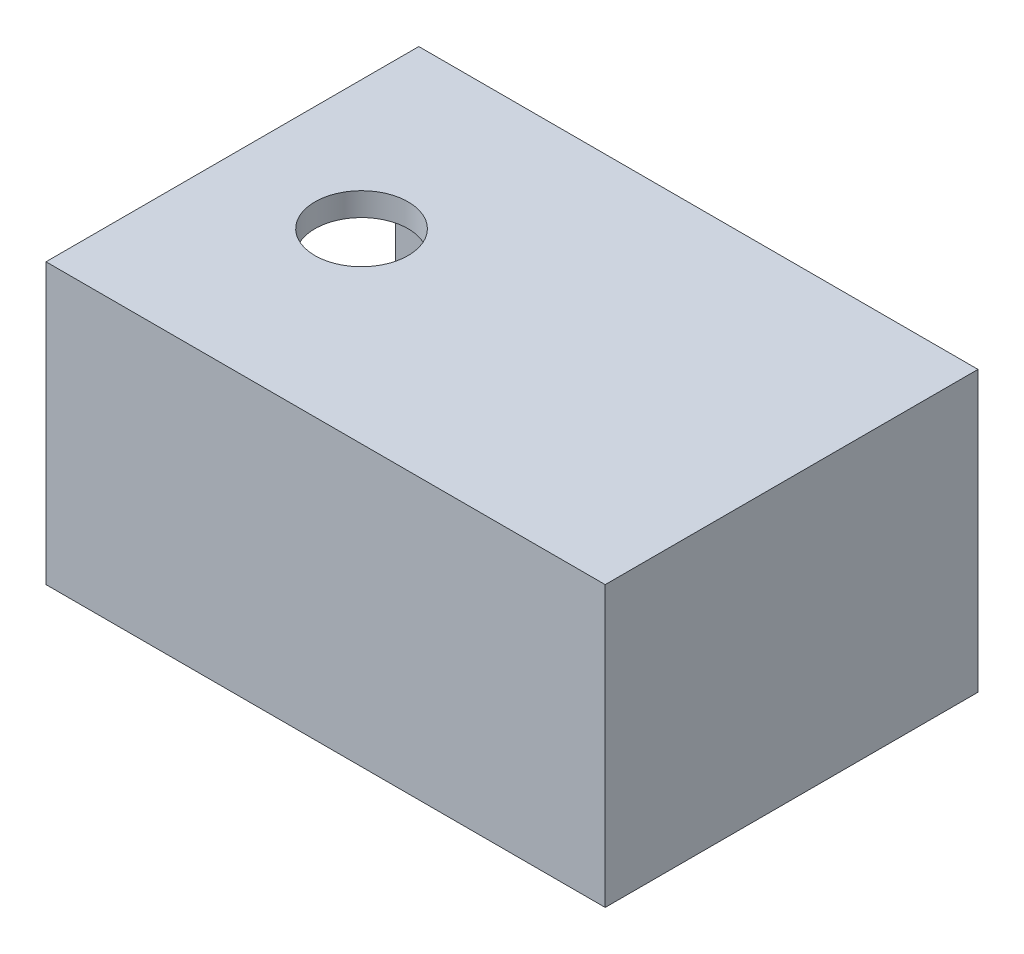
ISO-10303-21;
HEADER;
FILE_DESCRIPTION(('STEP AP214'),'2;1');
FILE_NAME('part.step','',(''),(''),'','','');
FILE_SCHEMA(('AUTOMOTIVE_DESIGN { 1 0 10303 214 1 1 1 1 }'));
ENDSEC;
DATA;
#1=APPLICATION_CONTEXT('core data for automotive mechanical design processes');
#2=APPLICATION_PROTOCOL_DEFINITION('international standard','automotive_design',2000,#1);
#3=PRODUCT_CONTEXT('',#1,'mechanical');
#4=PRODUCT('Part','Part','',(#3));
#5=PRODUCT_RELATED_PRODUCT_CATEGORY('part','',(#4));
#6=PRODUCT_DEFINITION_FORMATION('','',#4);
#7=PRODUCT_DEFINITION_CONTEXT('part definition',#1,'design');
#8=PRODUCT_DEFINITION('design','',#6,#7);
#9=PRODUCT_DEFINITION_SHAPE('','',#8);
#10=(LENGTH_UNIT() NAMED_UNIT(*) SI_UNIT(.MILLI.,.METRE.));
#11=(NAMED_UNIT(*) PLANE_ANGLE_UNIT() SI_UNIT($,.RADIAN.));
#12=(NAMED_UNIT(*) SI_UNIT($,.STERADIAN.) SOLID_ANGLE_UNIT());
#13=UNCERTAINTY_MEASURE_WITH_UNIT(LENGTH_MEASURE(1.E-05),#10,'distance_accuracy_value','');
#14=(GEOMETRIC_REPRESENTATION_CONTEXT(3) GLOBAL_UNCERTAINTY_ASSIGNED_CONTEXT((#13)) GLOBAL_UNIT_ASSIGNED_CONTEXT((#10,
#11,#12)) REPRESENTATION_CONTEXT('',''));
#15=CARTESIAN_POINT('',(0.,0.,0.));
#16=DIRECTION('',(0.,0.,1.));
#17=DIRECTION('',(1.,0.,0.));
#18=AXIS2_PLACEMENT_3D('',#15,#16,#17);
#19=CARTESIAN_POINT('',(-40.6105391688684,30.,17.562891057013));
#20=DIRECTION('',(1.,0.,0.));
#21=DIRECTION('',(0.,0.,-1.));
#22=AXIS2_PLACEMENT_3D('',#19,#20,#21);
#23=PLANE('',#22);
#24=DIRECTION('',(0.,1.,0.));
#25=VECTOR('',#24,1.);
#26=CARTESIAN_POINT('',(-40.6105391688684,2.5,15.062891057013));
#27=LINE('',#26,#25);
#28=CARTESIAN_POINT('',(-40.6105391688684,2.5,15.062891057013));
#29=VERTEX_POINT('',#28);
#30=CARTESIAN_POINT('',(-40.6105391688684,27.5,15.062891057013));
#31=VERTEX_POINT('',#30);
#32=EDGE_CURVE('E142',#29,#31,#27,.T.);
#33=ORIENTED_EDGE('',*,*,#32,.F.);
#34=DIRECTION('',(0.,0.,1.));
#35=VECTOR('',#34,1.);
#36=CARTESIAN_POINT('',(-40.6105391688684,2.5,-19.937108942987));
#37=LINE('',#36,#35);
#38=CARTESIAN_POINT('',(-40.6105391688684,2.5,-19.937108942987));
#39=VERTEX_POINT('',#38);
#40=EDGE_CURVE('E50',#39,#29,#37,.T.);
#41=ORIENTED_EDGE('',*,*,#40,.F.);
#42=DIRECTION('',(0.,-1.,0.));
#43=VECTOR('',#42,1.);
#44=CARTESIAN_POINT('',(-40.6105391688684,2.5,-19.937108942987));
#45=LINE('',#44,#43);
#46=CARTESIAN_POINT('',(-40.6105391688684,27.5,-19.937108942987));
#47=VERTEX_POINT('',#46);
#48=EDGE_CURVE('E130',#47,#39,#45,.T.);
#49=ORIENTED_EDGE('',*,*,#48,.F.);
#50=DIRECTION('',(0.,0.,-1.));
#51=VECTOR('',#50,1.);
#52=CARTESIAN_POINT('',(-40.6105391688684,27.5,-19.937108942987));
#53=LINE('',#52,#51);
#54=EDGE_CURVE('E133',#31,#47,#53,.T.);
#55=ORIENTED_EDGE('',*,*,#54,.F.);
#56=EDGE_LOOP('',(#33,#41,#49,#55));
#57=FACE_BOUND('',#56,.T.);
#58=DIRECTION('',(0.,0.,1.));
#59=VECTOR('',#58,1.);
#60=CARTESIAN_POINT('',(-40.6105391688684,0.,17.562891057013));
#61=LINE('',#60,#59);
#62=CARTESIAN_POINT('',(-40.6105391688684,0.,-22.437108942987));
#63=VERTEX_POINT('',#62);
#64=CARTESIAN_POINT('',(-40.6105391688684,0.,17.562891057013));
#65=VERTEX_POINT('',#64);
#66=EDGE_CURVE('E148',#63,#65,#61,.T.);
#67=ORIENTED_EDGE('',*,*,#66,.T.);
#68=DIRECTION('',(0.,-1.,0.));
#69=VECTOR('',#68,1.);
#70=CARTESIAN_POINT('',(-40.6105391688684,30.,17.562891057013));
#71=LINE('',#70,#69);
#72=CARTESIAN_POINT('',(-40.6105391688684,30.,17.562891057013));
#73=VERTEX_POINT('',#72);
#74=EDGE_CURVE('E172',#73,#65,#71,.T.);
#75=ORIENTED_EDGE('',*,*,#74,.F.);
#76=DIRECTION('',(0.,0.,1.));
#77=VECTOR('',#76,1.);
#78=CARTESIAN_POINT('',(-40.6105391688684,30.,17.562891057013));
#79=LINE('',#78,#77);
#80=CARTESIAN_POINT('',(-40.6105391688684,30.,-22.437108942987));
#81=VERTEX_POINT('',#80);
#82=EDGE_CURVE('E152',#81,#73,#79,.T.);
#83=ORIENTED_EDGE('',*,*,#82,.F.);
#84=DIRECTION('',(0.,-1.,0.));
#85=VECTOR('',#84,1.);
#86=CARTESIAN_POINT('',(-40.6105391688684,30.,-22.437108942987));
#87=LINE('',#86,#85);
#88=EDGE_CURVE('E158',#81,#63,#87,.T.);
#89=ORIENTED_EDGE('',*,*,#88,.T.);
#90=EDGE_LOOP('',(#67,#75,#83,#89));
#91=FACE_BOUND('',#90,.T.);
#92=ADVANCED_FACE('F34',(#57,#91),#23,.F.);
#93=CARTESIAN_POINT('',(-40.6105391688684,30.,17.562891057013));
#94=DIRECTION('',(0.,0.,-1.));
#95=DIRECTION('',(-1.,0.,0.));
#96=AXIS2_PLACEMENT_3D('',#93,#94,#95);
#97=PLANE('',#96);
#98=DIRECTION('',(1.,0.,0.));
#99=VECTOR('',#98,1.);
#100=CARTESIAN_POINT('',(-40.6105391688684,0.,17.562891057013));
#101=LINE('',#100,#99);
#102=CARTESIAN_POINT('',(19.3894608311315,0.,17.562891057013));
#103=VERTEX_POINT('',#102);
#104=EDGE_CURVE('E161',#65,#103,#101,.T.);
#105=ORIENTED_EDGE('',*,*,#104,.T.);
#106=DIRECTION('',(0.,-1.,0.));
#107=VECTOR('',#106,1.);
#108=CARTESIAN_POINT('',(19.3894608311315,30.,17.562891057013));
#109=LINE('',#108,#107);
#110=CARTESIAN_POINT('',(19.3894608311315,30.,17.562891057013));
#111=VERTEX_POINT('',#110);
#112=EDGE_CURVE('E169',#111,#103,#109,.T.);
#113=ORIENTED_EDGE('',*,*,#112,.F.);
#114=DIRECTION('',(1.,0.,0.));
#115=VECTOR('',#114,1.);
#116=CARTESIAN_POINT('',(-40.6105391688684,30.,17.562891057013));
#117=LINE('',#116,#115);
#118=EDGE_CURVE('E88',#73,#111,#117,.T.);
#119=ORIENTED_EDGE('',*,*,#118,.F.);
#120=ORIENTED_EDGE('',*,*,#74,.T.);
#121=EDGE_LOOP('',(#105,#113,#119,#120));
#122=FACE_BOUND('',#121,.T.);
#123=ADVANCED_FACE('F192',(#122),#97,.F.);
#124=CARTESIAN_POINT('',(19.3894608311315,30.,17.562891057013));
#125=DIRECTION('',(-1.,0.,0.));
#126=DIRECTION('',(0.,0.,1.));
#127=AXIS2_PLACEMENT_3D('',#124,#125,#126);
#128=PLANE('',#127);
#129=DIRECTION('',(0.,0.,-1.));
#130=VECTOR('',#129,1.);
#131=CARTESIAN_POINT('',(19.3894608311315,0.,17.562891057013));
#132=LINE('',#131,#130);
#133=CARTESIAN_POINT('',(19.3894608311316,0.,-22.437108942987));
#134=VERTEX_POINT('',#133);
#135=EDGE_CURVE('E163',#103,#134,#132,.T.);
#136=ORIENTED_EDGE('',*,*,#135,.T.);
#137=DIRECTION('',(0.,-1.,0.));
#138=VECTOR('',#137,1.);
#139=CARTESIAN_POINT('',(19.3894608311316,30.,-22.437108942987));
#140=LINE('',#139,#138);
#141=CARTESIAN_POINT('',(19.3894608311316,30.,-22.437108942987));
#142=VERTEX_POINT('',#141);
#143=EDGE_CURVE('E167',#142,#134,#140,.T.);
#144=ORIENTED_EDGE('',*,*,#143,.F.);
#145=DIRECTION('',(0.,0.,-1.));
#146=VECTOR('',#145,1.);
#147=CARTESIAN_POINT('',(19.3894608311315,30.,17.562891057013));
#148=LINE('',#147,#146);
#149=EDGE_CURVE('E155',#111,#142,#148,.T.);
#150=ORIENTED_EDGE('',*,*,#149,.F.);
#151=ORIENTED_EDGE('',*,*,#112,.T.);
#152=EDGE_LOOP('',(#136,#144,#150,#151));
#153=FACE_BOUND('',#152,.T.);
#154=ADVANCED_FACE('F197',(#153),#128,.F.);
#155=CARTESIAN_POINT('',(-40.6105391688684,30.,-22.437108942987));
#156=DIRECTION('',(0.,0.,1.));
#157=DIRECTION('',(1.,0.,0.));
#158=AXIS2_PLACEMENT_3D('',#155,#156,#157);
#159=PLANE('',#158);
#160=ORIENTED_EDGE('',*,*,#88,.F.);
#161=DIRECTION('',(-1.,0.,0.));
#162=VECTOR('',#161,1.);
#163=CARTESIAN_POINT('',(-40.6105391688684,30.,-22.437108942987));
#164=LINE('',#163,#162);
#165=EDGE_CURVE('E59',#142,#81,#164,.T.);
#166=ORIENTED_EDGE('',*,*,#165,.F.);
#167=ORIENTED_EDGE('',*,*,#143,.T.);
#168=DIRECTION('',(-1.,0.,0.));
#169=VECTOR('',#168,1.);
#170=CARTESIAN_POINT('',(-40.6105391688684,0.,-22.437108942987));
#171=LINE('',#170,#169);
#172=EDGE_CURVE('E80',#134,#63,#171,.T.);
#173=ORIENTED_EDGE('',*,*,#172,.T.);
#174=EDGE_LOOP('',(#160,#166,#167,#173));
#175=FACE_BOUND('',#174,.T.);
#176=ADVANCED_FACE('F203',(#175),#159,.F.);
#177=CARTESIAN_POINT('',(0.,30.,0.));
#178=DIRECTION('',(0.,-1.,0.));
#179=DIRECTION('',(0.,0.,-1.));
#180=AXIS2_PLACEMENT_3D('',#177,#178,#179);
#181=PLANE('',#180);
#182=CARTESIAN_POINT('',(-26.7546865202064,30.,-2.43710894298702));
#183=DIRECTION('',(0.,1.,0.));
#184=DIRECTION('',(0.,0.,1.));
#185=AXIS2_PLACEMENT_3D('',#182,#183,#184);
#186=CIRCLE('',#185,5.);
#187=CARTESIAN_POINT('',(-26.7546865202064,30.,2.56289105701298));
#188=VERTEX_POINT('',#187);
#189=EDGE_CURVE('E314',#188,#188,#186,.T.);
#190=ORIENTED_EDGE('',*,*,#189,.F.);
#191=EDGE_LOOP('',(#190));
#192=FACE_BOUND('',#191,.T.);
#193=ORIENTED_EDGE('',*,*,#118,.T.);
#194=ORIENTED_EDGE('',*,*,#149,.T.);
#195=ORIENTED_EDGE('',*,*,#165,.T.);
#196=ORIENTED_EDGE('',*,*,#82,.T.);
#197=EDGE_LOOP('',(#193,#194,#195,#196));
#198=FACE_BOUND('',#197,.T.);
#199=ADVANCED_FACE('F207',(#192,#198),#181,.F.);
#200=CARTESIAN_POINT('',(0.,0.,0.));
#201=DIRECTION('',(0.,-1.,0.));
#202=DIRECTION('',(0.,0.,-1.));
#203=AXIS2_PLACEMENT_3D('',#200,#201,#202);
#204=PLANE('',#203);
#205=CARTESIAN_POINT('',(-26.7546865202064,0.,-2.43710894298702));
#206=DIRECTION('',(0.,-1.,0.));
#207=DIRECTION('',(0.,0.,-1.));
#208=AXIS2_PLACEMENT_3D('',#205,#206,#207);
#209=CIRCLE('',#208,2.5);
#210=CARTESIAN_POINT('',(-26.7546865202064,0.,-4.93710894298702));
#211=VERTEX_POINT('',#210);
#212=EDGE_CURVE('E136',#211,#211,#209,.T.);
#213=ORIENTED_EDGE('',*,*,#212,.F.);
#214=EDGE_LOOP('',(#213));
#215=FACE_BOUND('',#214,.T.);
#216=ORIENTED_EDGE('',*,*,#66,.F.);
#217=ORIENTED_EDGE('',*,*,#172,.F.);
#218=ORIENTED_EDGE('',*,*,#135,.F.);
#219=ORIENTED_EDGE('',*,*,#104,.F.);
#220=EDGE_LOOP('',(#216,#217,#218,#219));
#221=FACE_BOUND('',#220,.T.);
#222=ADVANCED_FACE('F208',(#215,#221),#204,.T.);
#223=CARTESIAN_POINT('',(16.8894608311316,2.5,-19.937108942987));
#224=DIRECTION('',(0.,-1.,0.));
#225=DIRECTION('',(0.,0.,-1.));
#226=AXIS2_PLACEMENT_3D('',#223,#224,#225);
#227=PLANE('',#226);
#228=CARTESIAN_POINT('',(-26.7546865202064,2.5,-2.43710894298702));
#229=DIRECTION('',(0.,-1.,0.));
#230=DIRECTION('',(0.,0.,-1.));
#231=AXIS2_PLACEMENT_3D('',#228,#229,#230);
#232=CIRCLE('',#231,3.5);
#233=CARTESIAN_POINT('',(-26.7546865202064,2.5,-5.93710894298702));
#234=VERTEX_POINT('',#233);
#235=EDGE_CURVE('E43',#234,#234,#232,.T.);
#236=ORIENTED_EDGE('',*,*,#235,.T.);
#237=EDGE_LOOP('',(#236));
#238=FACE_BOUND('',#237,.T.);
#239=ORIENTED_EDGE('',*,*,#40,.T.);
#240=DIRECTION('',(-1.,0.,0.));
#241=VECTOR('',#240,1.);
#242=CARTESIAN_POINT('',(16.8894608311316,2.5,15.062891057013));
#243=LINE('',#242,#241);
#244=CARTESIAN_POINT('',(16.8894608311316,2.5,15.062891057013));
#245=VERTEX_POINT('',#244);
#246=EDGE_CURVE('E108',#245,#29,#243,.T.);
#247=ORIENTED_EDGE('',*,*,#246,.F.);
#248=DIRECTION('',(0.,0.,1.));
#249=VECTOR('',#248,1.);
#250=CARTESIAN_POINT('',(16.8894608311316,2.5,-19.937108942987));
#251=LINE('',#250,#249);
#252=CARTESIAN_POINT('',(16.8894608311316,2.5,-19.937108942987));
#253=VERTEX_POINT('',#252);
#254=EDGE_CURVE('E112',#253,#245,#251,.T.);
#255=ORIENTED_EDGE('',*,*,#254,.F.);
#256=DIRECTION('',(-1.,0.,0.));
#257=VECTOR('',#256,1.);
#258=CARTESIAN_POINT('',(16.8894608311316,2.5,-19.937108942987));
#259=LINE('',#258,#257);
#260=EDGE_CURVE('E146',#253,#39,#259,.T.);
#261=ORIENTED_EDGE('',*,*,#260,.T.);
#262=EDGE_LOOP('',(#239,#247,#255,#261));
#263=FACE_BOUND('',#262,.T.);
#264=ADVANCED_FACE('F110',(#238,#263),#227,.F.);
#265=CARTESIAN_POINT('',(16.8894608311316,2.5,-19.937108942987));
#266=DIRECTION('',(0.,0.,-1.));
#267=DIRECTION('',(-1.,0.,0.));
#268=AXIS2_PLACEMENT_3D('',#265,#266,#267);
#269=PLANE('',#268);
#270=ORIENTED_EDGE('',*,*,#48,.T.);
#271=ORIENTED_EDGE('',*,*,#260,.F.);
#272=DIRECTION('',(0.,-1.,0.));
#273=VECTOR('',#272,1.);
#274=CARTESIAN_POINT('',(16.8894608311316,2.5,-19.937108942987));
#275=LINE('',#274,#273);
#276=CARTESIAN_POINT('',(16.8894608311316,27.5,-19.937108942987));
#277=VERTEX_POINT('',#276);
#278=EDGE_CURVE('E118',#277,#253,#275,.T.);
#279=ORIENTED_EDGE('',*,*,#278,.F.);
#280=DIRECTION('',(-1.,0.,0.));
#281=VECTOR('',#280,1.);
#282=CARTESIAN_POINT('',(16.8894608311316,27.5,-19.937108942987));
#283=LINE('',#282,#281);
#284=EDGE_CURVE('E149',#277,#47,#283,.T.);
#285=ORIENTED_EDGE('',*,*,#284,.T.);
#286=EDGE_LOOP('',(#270,#271,#279,#285));
#287=FACE_BOUND('',#286,.T.);
#288=ADVANCED_FACE('F217',(#287),#269,.F.);
#289=CARTESIAN_POINT('',(16.8894608311316,27.5,-19.937108942987));
#290=DIRECTION('',(0.,1.,0.));
#291=DIRECTION('',(0.,0.,1.));
#292=AXIS2_PLACEMENT_3D('',#289,#290,#291);
#293=PLANE('',#292);
#294=CARTESIAN_POINT('',(-26.7546865202064,27.5,-2.43710894298702));
#295=DIRECTION('',(0.,1.,0.));
#296=DIRECTION('',(0.,0.,1.));
#297=AXIS2_PLACEMENT_3D('',#294,#295,#296);
#298=CIRCLE('',#297,5.);
#299=CARTESIAN_POINT('',(-26.7546865202064,27.5,2.56289105701298));
#300=VERTEX_POINT('',#299);
#301=EDGE_CURVE('E38',#300,#300,#298,.T.);
#302=ORIENTED_EDGE('',*,*,#301,.T.);
#303=EDGE_LOOP('',(#302));
#304=FACE_BOUND('',#303,.T.);
#305=ORIENTED_EDGE('',*,*,#54,.T.);
#306=ORIENTED_EDGE('',*,*,#284,.F.);
#307=DIRECTION('',(0.,0.,-1.));
#308=VECTOR('',#307,1.);
#309=CARTESIAN_POINT('',(16.8894608311316,27.5,-19.937108942987));
#310=LINE('',#309,#308);
#311=CARTESIAN_POINT('',(16.8894608311316,27.5,15.062891057013));
#312=VERTEX_POINT('',#311);
#313=EDGE_CURVE('E126',#312,#277,#310,.T.);
#314=ORIENTED_EDGE('',*,*,#313,.F.);
#315=DIRECTION('',(-1.,0.,0.));
#316=VECTOR('',#315,1.);
#317=CARTESIAN_POINT('',(16.8894608311316,27.5,15.062891057013));
#318=LINE('',#317,#316);
#319=EDGE_CURVE('E117',#312,#31,#318,.T.);
#320=ORIENTED_EDGE('',*,*,#319,.T.);
#321=EDGE_LOOP('',(#305,#306,#314,#320));
#322=FACE_BOUND('',#321,.T.);
#323=ADVANCED_FACE('F220',(#304,#322),#293,.F.);
#324=CARTESIAN_POINT('',(16.8894608311316,2.5,15.062891057013));
#325=DIRECTION('',(0.,0.,1.));
#326=DIRECTION('',(0.,-1.,0.));
#327=AXIS2_PLACEMENT_3D('',#324,#325,#326);
#328=PLANE('',#327);
#329=ORIENTED_EDGE('',*,*,#32,.T.);
#330=ORIENTED_EDGE('',*,*,#319,.F.);
#331=DIRECTION('',(0.,1.,0.));
#332=VECTOR('',#331,1.);
#333=CARTESIAN_POINT('',(16.8894608311316,2.5,15.062891057013));
#334=LINE('',#333,#332);
#335=EDGE_CURVE('E121',#245,#312,#334,.T.);
#336=ORIENTED_EDGE('',*,*,#335,.F.);
#337=ORIENTED_EDGE('',*,*,#246,.T.);
#338=EDGE_LOOP('',(#329,#330,#336,#337));
#339=FACE_BOUND('',#338,.T.);
#340=ADVANCED_FACE('F122',(#339),#328,.F.);
#341=CARTESIAN_POINT('',(16.8894608311316,0.,0.));
#342=DIRECTION('',(-1.,0.,0.));
#343=DIRECTION('',(0.,0.,1.));
#344=AXIS2_PLACEMENT_3D('',#341,#342,#343);
#345=PLANE('',#344);
#346=ORIENTED_EDGE('',*,*,#254,.T.);
#347=ORIENTED_EDGE('',*,*,#335,.T.);
#348=ORIENTED_EDGE('',*,*,#313,.T.);
#349=ORIENTED_EDGE('',*,*,#278,.T.);
#350=EDGE_LOOP('',(#346,#347,#348,#349));
#351=FACE_BOUND('',#350,.T.);
#352=ADVANCED_FACE('F128',(#351),#345,.T.);
#353=CARTESIAN_POINT('',(-26.7546865202064,-27.5,-2.43710894298702));
#354=DIRECTION('',(0.,1.,0.));
#355=DIRECTION('',(0.,0.,1.));
#356=AXIS2_PLACEMENT_3D('',#353,#354,#355);
#357=CYLINDRICAL_SURFACE('',#356,2.5);
#358=CARTESIAN_POINT('',(-26.7546865202064,1.5,-2.43710894298702));
#359=DIRECTION('',(0.,-1.,0.));
#360=DIRECTION('',(0.,0.,-1.));
#361=AXIS2_PLACEMENT_3D('',#358,#359,#360);
#362=CIRCLE('',#361,2.5);
#363=CARTESIAN_POINT('',(-26.7546865202064,1.5,-4.93710894298702));
#364=VERTEX_POINT('',#363);
#365=EDGE_CURVE('E12',#364,#364,#362,.F.);
#366=ORIENTED_EDGE('',*,*,#365,.T.);
#367=EDGE_LOOP('',(#366));
#368=FACE_BOUND('',#367,.T.);
#369=ORIENTED_EDGE('',*,*,#212,.T.);
#370=EDGE_LOOP('',(#369));
#371=FACE_BOUND('',#370,.T.);
#372=ADVANCED_FACE('F180',(#368,#371),#357,.F.);
#373=CARTESIAN_POINT('',(-26.7546865202064,1.5,-2.43710894298702));
#374=DIRECTION('',(0.,-1.,0.));
#375=DIRECTION('',(0.,0.,-1.));
#376=AXIS2_PLACEMENT_3D('',#373,#374,#375);
#377=TOROIDAL_SURFACE('',#376,3.5,1.);
#378=ORIENTED_EDGE('',*,*,#365,.F.);
#379=EDGE_LOOP('',(#378));
#380=FACE_BOUND('',#379,.T.);
#381=ORIENTED_EDGE('',*,*,#235,.F.);
#382=EDGE_LOOP('',(#381));
#383=FACE_BOUND('',#382,.T.);
#384=ADVANCED_FACE('F36',(#380,#383),#377,.T.);
#385=CARTESIAN_POINT('',(-26.7546865202064,10.,-2.43710894298702));
#386=DIRECTION('',(0.,1.,0.));
#387=DIRECTION('',(0.,0.,1.));
#388=AXIS2_PLACEMENT_3D('',#385,#386,#387);
#389=CYLINDRICAL_SURFACE('',#388,5.);
#390=ORIENTED_EDGE('',*,*,#189,.T.);
#391=EDGE_LOOP('',(#390));
#392=FACE_BOUND('',#391,.T.);
#393=ORIENTED_EDGE('',*,*,#301,.F.);
#394=EDGE_LOOP('',(#393));
#395=FACE_BOUND('',#394,.T.);
#396=ADVANCED_FACE('F179',(#392,#395),#389,.F.);
#397=CLOSED_SHELL('',(#92,#123,#154,#176,#199,#222,#264,#288,#323,#340,#352,#372,#384,#396));
#398=MANIFOLD_SOLID_BREP('B2',#397);
#399=ADVANCED_BREP_SHAPE_REPRESENTATION('',(#18,#398),#14);
#400=SHAPE_DEFINITION_REPRESENTATION(#9,#399);
ENDSEC;
END-ISO-10303-21;
